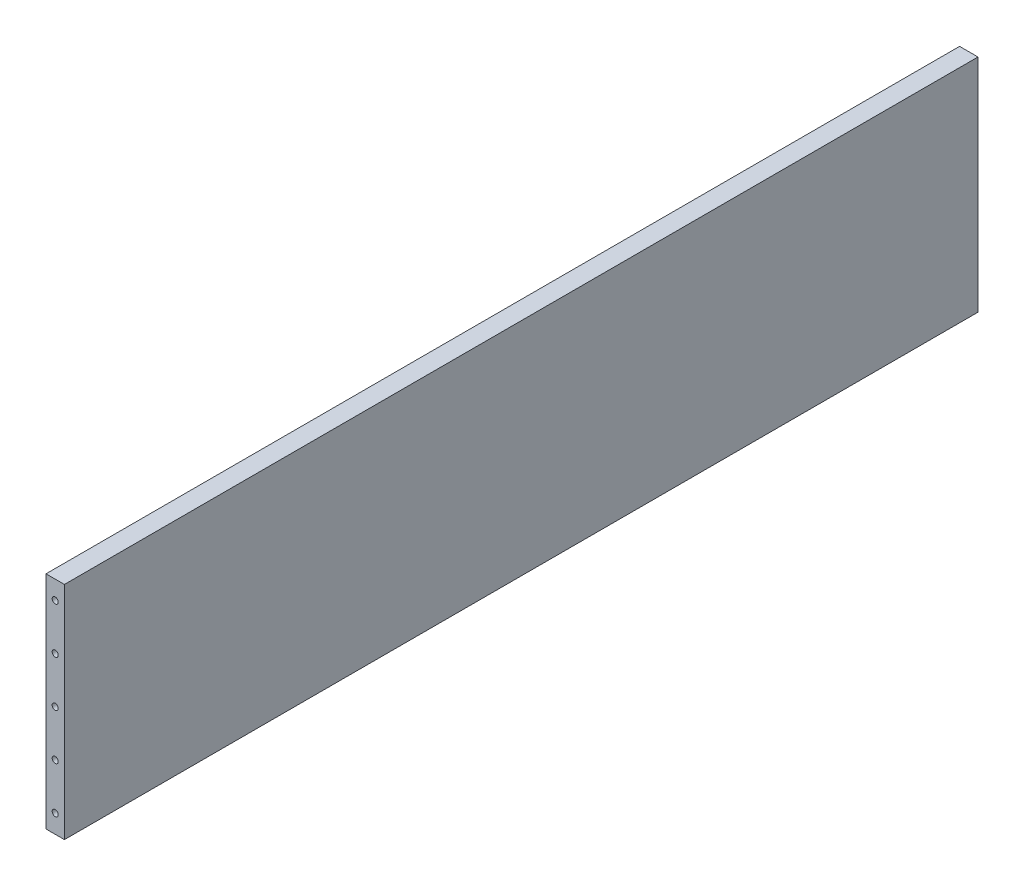
ISO-10303-21;
HEADER;
FILE_DESCRIPTION(('STEP AP214'),'2;1');
FILE_NAME('part.step','',(''),(''),'','','');
FILE_SCHEMA(('AUTOMOTIVE_DESIGN { 1 0 10303 214 1 1 1 1 }'));
ENDSEC;
DATA;
#1=APPLICATION_CONTEXT('core data for automotive mechanical design processes');
#2=APPLICATION_PROTOCOL_DEFINITION('international standard','automotive_design',2000,#1);
#3=PRODUCT_CONTEXT('',#1,'mechanical');
#4=PRODUCT('Part','Part','',(#3));
#5=PRODUCT_RELATED_PRODUCT_CATEGORY('part','',(#4));
#6=PRODUCT_DEFINITION_FORMATION('','',#4);
#7=PRODUCT_DEFINITION_CONTEXT('part definition',#1,'design');
#8=PRODUCT_DEFINITION('design','',#6,#7);
#9=PRODUCT_DEFINITION_SHAPE('','',#8);
#10=(LENGTH_UNIT() NAMED_UNIT(*) SI_UNIT(.MILLI.,.METRE.));
#11=(NAMED_UNIT(*) PLANE_ANGLE_UNIT() SI_UNIT($,.RADIAN.));
#12=(NAMED_UNIT(*) SI_UNIT($,.STERADIAN.) SOLID_ANGLE_UNIT());
#13=UNCERTAINTY_MEASURE_WITH_UNIT(LENGTH_MEASURE(1.E-05),#10,'distance_accuracy_value','');
#14=(GEOMETRIC_REPRESENTATION_CONTEXT(3) GLOBAL_UNCERTAINTY_ASSIGNED_CONTEXT((#13)) GLOBAL_UNIT_ASSIGNED_CONTEXT((#10,
#11,#12)) REPRESENTATION_CONTEXT('',''));
#15=CARTESIAN_POINT('',(0.,0.,0.));
#16=DIRECTION('',(0.,0.,1.));
#17=DIRECTION('',(1.,0.,0.));
#18=AXIS2_PLACEMENT_3D('',#15,#16,#17);
#19=CARTESIAN_POINT('',(0.,0.,496.));
#20=DIRECTION('',(-1.,0.,0.));
#21=DIRECTION('',(0.,0.,1.));
#22=AXIS2_PLACEMENT_3D('',#19,#20,#21);
#23=PLANE('',#22);
#24=DIRECTION('',(0.,1.,0.));
#25=VECTOR('',#24,1.);
#26=CARTESIAN_POINT('',(0.,0.,0.));
#27=LINE('',#26,#25);
#28=CARTESIAN_POINT('',(0.,-120.,0.));
#29=VERTEX_POINT('',#28);
#30=CARTESIAN_POINT('',(0.,0.,0.));
#31=VERTEX_POINT('',#30);
#32=EDGE_CURVE('E180',#29,#31,#27,.T.);
#33=ORIENTED_EDGE('',*,*,#32,.T.);
#34=DIRECTION('',(0.,0.,-1.));
#35=VECTOR('',#34,1.);
#36=CARTESIAN_POINT('',(0.,0.,496.));
#37=LINE('',#36,#35);
#38=CARTESIAN_POINT('',(0.,0.,496.));
#39=VERTEX_POINT('',#38);
#40=EDGE_CURVE('E11',#39,#31,#37,.T.);
#41=ORIENTED_EDGE('',*,*,#40,.F.);
#42=DIRECTION('',(0.,1.,0.));
#43=VECTOR('',#42,1.);
#44=CARTESIAN_POINT('',(0.,0.,496.));
#45=LINE('',#44,#43);
#46=CARTESIAN_POINT('',(0.,-120.,496.));
#47=VERTEX_POINT('',#46);
#48=EDGE_CURVE('E181',#47,#39,#45,.T.);
#49=ORIENTED_EDGE('',*,*,#48,.F.);
#50=DIRECTION('',(0.,0.,-1.));
#51=VECTOR('',#50,1.);
#52=CARTESIAN_POINT('',(0.,-120.,496.));
#53=LINE('',#52,#51);
#54=EDGE_CURVE('E187',#47,#29,#53,.T.);
#55=ORIENTED_EDGE('',*,*,#54,.T.);
#56=EDGE_LOOP('',(#33,#41,#49,#55));
#57=FACE_BOUND('',#56,.T.);
#58=ADVANCED_FACE('F33',(#57),#23,.F.);
#59=CARTESIAN_POINT('',(-9.99999999999999,0.,496.));
#60=DIRECTION('',(0.,-1.,0.));
#61=DIRECTION('',(0.,0.,-1.));
#62=AXIS2_PLACEMENT_3D('',#59,#60,#61);
#63=PLANE('',#62);
#64=DIRECTION('',(-1.,0.,0.));
#65=VECTOR('',#64,1.);
#66=CARTESIAN_POINT('',(-9.99999999999999,0.,0.));
#67=LINE('',#66,#65);
#68=CARTESIAN_POINT('',(-9.99999999999999,0.,0.));
#69=VERTEX_POINT('',#68);
#70=EDGE_CURVE('E190',#31,#69,#67,.T.);
#71=ORIENTED_EDGE('',*,*,#70,.T.);
#72=DIRECTION('',(0.,0.,-1.));
#73=VECTOR('',#72,1.);
#74=CARTESIAN_POINT('',(-9.99999999999999,0.,496.));
#75=LINE('',#74,#73);
#76=CARTESIAN_POINT('',(-9.99999999999999,0.,496.));
#77=VERTEX_POINT('',#76);
#78=EDGE_CURVE('E41',#77,#69,#75,.T.);
#79=ORIENTED_EDGE('',*,*,#78,.F.);
#80=DIRECTION('',(-1.,0.,0.));
#81=VECTOR('',#80,1.);
#82=CARTESIAN_POINT('',(-9.99999999999999,0.,496.));
#83=LINE('',#82,#81);
#84=EDGE_CURVE('E80',#39,#77,#83,.T.);
#85=ORIENTED_EDGE('',*,*,#84,.F.);
#86=ORIENTED_EDGE('',*,*,#40,.T.);
#87=EDGE_LOOP('',(#71,#79,#85,#86));
#88=FACE_BOUND('',#87,.T.);
#89=ADVANCED_FACE('F214',(#88),#63,.F.);
#90=CARTESIAN_POINT('',(-9.99999999999999,-120.,496.));
#91=DIRECTION('',(1.,0.,0.));
#92=DIRECTION('',(0.,0.,-1.));
#93=AXIS2_PLACEMENT_3D('',#90,#91,#92);
#94=PLANE('',#93);
#95=DIRECTION('',(0.,-1.,0.));
#96=VECTOR('',#95,1.);
#97=CARTESIAN_POINT('',(-9.99999999999999,-120.,0.));
#98=LINE('',#97,#96);
#99=CARTESIAN_POINT('',(-9.99999999999999,-120.,0.));
#100=VERTEX_POINT('',#99);
#101=EDGE_CURVE('E67',#69,#100,#98,.T.);
#102=ORIENTED_EDGE('',*,*,#101,.T.);
#103=DIRECTION('',(0.,0.,-1.));
#104=VECTOR('',#103,1.);
#105=CARTESIAN_POINT('',(-9.99999999999999,-120.,496.));
#106=LINE('',#105,#104);
#107=CARTESIAN_POINT('',(-9.99999999999999,-120.,496.));
#108=VERTEX_POINT('',#107);
#109=EDGE_CURVE('E195',#108,#100,#106,.T.);
#110=ORIENTED_EDGE('',*,*,#109,.F.);
#111=DIRECTION('',(0.,-1.,0.));
#112=VECTOR('',#111,1.);
#113=CARTESIAN_POINT('',(-9.99999999999999,-120.,496.));
#114=LINE('',#113,#112);
#115=EDGE_CURVE('E184',#77,#108,#114,.T.);
#116=ORIENTED_EDGE('',*,*,#115,.F.);
#117=ORIENTED_EDGE('',*,*,#78,.T.);
#118=EDGE_LOOP('',(#102,#110,#116,#117));
#119=FACE_BOUND('',#118,.T.);
#120=ADVANCED_FACE('F197',(#119),#94,.F.);
#121=CARTESIAN_POINT('',(0.,-120.,496.));
#122=DIRECTION('',(0.,1.,0.));
#123=DIRECTION('',(0.,0.,1.));
#124=AXIS2_PLACEMENT_3D('',#121,#122,#123);
#125=PLANE('',#124);
#126=DIRECTION('',(1.,0.,0.));
#127=VECTOR('',#126,1.);
#128=CARTESIAN_POINT('',(0.,-120.,0.));
#129=LINE('',#128,#127);
#130=EDGE_CURVE('E73',#100,#29,#129,.T.);
#131=ORIENTED_EDGE('',*,*,#130,.T.);
#132=ORIENTED_EDGE('',*,*,#54,.F.);
#133=DIRECTION('',(1.,0.,0.));
#134=VECTOR('',#133,1.);
#135=CARTESIAN_POINT('',(0.,-120.,496.));
#136=LINE('',#135,#134);
#137=EDGE_CURVE('E49',#108,#47,#136,.T.);
#138=ORIENTED_EDGE('',*,*,#137,.F.);
#139=ORIENTED_EDGE('',*,*,#109,.T.);
#140=EDGE_LOOP('',(#131,#132,#138,#139));
#141=FACE_BOUND('',#140,.T.);
#142=ADVANCED_FACE('F204',(#141),#125,.F.);
#143=CARTESIAN_POINT('',(0.,0.,496.));
#144=DIRECTION('',(0.,0.,-1.));
#145=DIRECTION('',(-1.,0.,0.));
#146=AXIS2_PLACEMENT_3D('',#143,#144,#145);
#147=PLANE('',#146);
#148=CARTESIAN_POINT('',(-5.00000000000017,-9.99999999999999,496.));
#149=DIRECTION('',(0.,0.,1.));
#150=DIRECTION('',(1.,0.,0.));
#151=AXIS2_PLACEMENT_3D('',#148,#149,#150);
#152=CIRCLE('',#151,1.64999999999999);
#153=CARTESIAN_POINT('',(-3.35000000000018,-9.99999999999999,496.));
#154=VERTEX_POINT('',#153);
#155=EDGE_CURVE('E150',#154,#154,#152,.T.);
#156=ORIENTED_EDGE('',*,*,#155,.F.);
#157=EDGE_LOOP('',(#156));
#158=FACE_BOUND('',#157,.T.);
#159=CARTESIAN_POINT('',(-5.00000000000008,-35.,496.));
#160=DIRECTION('',(0.,0.,1.));
#161=DIRECTION('',(1.,0.,0.));
#162=AXIS2_PLACEMENT_3D('',#159,#160,#161);
#163=CIRCLE('',#162,1.64999999999999);
#164=CARTESIAN_POINT('',(-3.35000000000009,-35.,496.));
#165=VERTEX_POINT('',#164);
#166=EDGE_CURVE('E156',#165,#165,#163,.T.);
#167=ORIENTED_EDGE('',*,*,#166,.F.);
#168=EDGE_LOOP('',(#167));
#169=FACE_BOUND('',#168,.T.);
#170=CARTESIAN_POINT('',(-4.99999999999999,-60.,496.));
#171=DIRECTION('',(0.,0.,1.));
#172=DIRECTION('',(1.,0.,0.));
#173=AXIS2_PLACEMENT_3D('',#170,#171,#172);
#174=CIRCLE('',#173,1.64999999999999);
#175=CARTESIAN_POINT('',(-3.35,-60.,496.));
#176=VERTEX_POINT('',#175);
#177=EDGE_CURVE('E162',#176,#176,#174,.T.);
#178=ORIENTED_EDGE('',*,*,#177,.F.);
#179=EDGE_LOOP('',(#178));
#180=FACE_BOUND('',#179,.T.);
#181=CARTESIAN_POINT('',(-5.00000000000008,-85.,496.));
#182=DIRECTION('',(0.,0.,1.));
#183=DIRECTION('',(1.,0.,0.));
#184=AXIS2_PLACEMENT_3D('',#181,#182,#183);
#185=CIRCLE('',#184,1.64999999999999);
#186=CARTESIAN_POINT('',(-3.35000000000009,-85.,496.));
#187=VERTEX_POINT('',#186);
#188=EDGE_CURVE('E168',#187,#187,#185,.T.);
#189=ORIENTED_EDGE('',*,*,#188,.F.);
#190=EDGE_LOOP('',(#189));
#191=FACE_BOUND('',#190,.T.);
#192=CARTESIAN_POINT('',(-5.00000000000017,-110.,496.));
#193=DIRECTION('',(0.,0.,1.));
#194=DIRECTION('',(1.,0.,0.));
#195=AXIS2_PLACEMENT_3D('',#192,#193,#194);
#196=CIRCLE('',#195,1.64999999999999);
#197=CARTESIAN_POINT('',(-3.35000000000018,-110.,496.));
#198=VERTEX_POINT('',#197);
#199=EDGE_CURVE('E174',#198,#198,#196,.T.);
#200=ORIENTED_EDGE('',*,*,#199,.F.);
#201=EDGE_LOOP('',(#200));
#202=FACE_BOUND('',#201,.T.);
#203=ORIENTED_EDGE('',*,*,#48,.T.);
#204=ORIENTED_EDGE('',*,*,#84,.T.);
#205=ORIENTED_EDGE('',*,*,#115,.T.);
#206=ORIENTED_EDGE('',*,*,#137,.T.);
#207=EDGE_LOOP('',(#203,#204,#205,#206));
#208=FACE_BOUND('',#207,.T.);
#209=ADVANCED_FACE('F206',(#158,#169,#180,#191,#202,#208),#147,.F.);
#210=CARTESIAN_POINT('',(0.,0.,0.));
#211=DIRECTION('',(0.,0.,-1.));
#212=DIRECTION('',(-1.,0.,0.));
#213=AXIS2_PLACEMENT_3D('',#210,#211,#212);
#214=PLANE('',#213);
#215=CARTESIAN_POINT('',(-4.99999999999982,-9.99999999999999,0.));
#216=DIRECTION('',(0.,0.,-1.));
#217=DIRECTION('',(-1.,0.,0.));
#218=AXIS2_PLACEMENT_3D('',#215,#216,#217);
#219=CIRCLE('',#218,1.64999999999999);
#220=CARTESIAN_POINT('',(-6.64999999999981,-9.99999999999999,0.));
#221=VERTEX_POINT('',#220);
#222=EDGE_CURVE('E122',#221,#221,#219,.T.);
#223=ORIENTED_EDGE('',*,*,#222,.F.);
#224=EDGE_LOOP('',(#223));
#225=FACE_BOUND('',#224,.T.);
#226=CARTESIAN_POINT('',(-4.99999999999991,-35.,0.));
#227=DIRECTION('',(0.,0.,-1.));
#228=DIRECTION('',(-1.,0.,0.));
#229=AXIS2_PLACEMENT_3D('',#226,#227,#228);
#230=CIRCLE('',#229,1.64999999999999);
#231=CARTESIAN_POINT('',(-6.6499999999999,-35.,0.));
#232=VERTEX_POINT('',#231);
#233=EDGE_CURVE('E121',#232,#232,#230,.T.);
#234=ORIENTED_EDGE('',*,*,#233,.F.);
#235=EDGE_LOOP('',(#234));
#236=FACE_BOUND('',#235,.T.);
#237=CARTESIAN_POINT('',(-4.99999999999999,-60.,0.));
#238=DIRECTION('',(0.,0.,-1.));
#239=DIRECTION('',(-1.,0.,0.));
#240=AXIS2_PLACEMENT_3D('',#237,#238,#239);
#241=CIRCLE('',#240,1.64999999999999);
#242=CARTESIAN_POINT('',(-6.64999999999998,-60.,0.));
#243=VERTEX_POINT('',#242);
#244=EDGE_CURVE('E132',#243,#243,#241,.T.);
#245=ORIENTED_EDGE('',*,*,#244,.F.);
#246=EDGE_LOOP('',(#245));
#247=FACE_BOUND('',#246,.T.);
#248=CARTESIAN_POINT('',(-4.99999999999991,-85.,0.));
#249=DIRECTION('',(0.,0.,-1.));
#250=DIRECTION('',(-1.,0.,0.));
#251=AXIS2_PLACEMENT_3D('',#248,#249,#250);
#252=CIRCLE('',#251,1.64999999999999);
#253=CARTESIAN_POINT('',(-6.6499999999999,-85.,0.));
#254=VERTEX_POINT('',#253);
#255=EDGE_CURVE('E138',#254,#254,#252,.T.);
#256=ORIENTED_EDGE('',*,*,#255,.F.);
#257=EDGE_LOOP('',(#256));
#258=FACE_BOUND('',#257,.T.);
#259=CARTESIAN_POINT('',(-4.99999999999982,-110.,0.));
#260=DIRECTION('',(0.,0.,-1.));
#261=DIRECTION('',(-1.,0.,0.));
#262=AXIS2_PLACEMENT_3D('',#259,#260,#261);
#263=CIRCLE('',#262,1.64999999999999);
#264=CARTESIAN_POINT('',(-6.64999999999981,-110.,0.));
#265=VERTEX_POINT('',#264);
#266=EDGE_CURVE('E144',#265,#265,#263,.T.);
#267=ORIENTED_EDGE('',*,*,#266,.F.);
#268=EDGE_LOOP('',(#267));
#269=FACE_BOUND('',#268,.T.);
#270=ORIENTED_EDGE('',*,*,#32,.F.);
#271=ORIENTED_EDGE('',*,*,#130,.F.);
#272=ORIENTED_EDGE('',*,*,#101,.F.);
#273=ORIENTED_EDGE('',*,*,#70,.F.);
#274=EDGE_LOOP('',(#270,#271,#272,#273));
#275=FACE_BOUND('',#274,.T.);
#276=ADVANCED_FACE('F200',(#225,#236,#247,#258,#269,#275),#214,.T.);
#277=CARTESIAN_POINT('',(-5.00000000000017,-110.,481.9));
#278=DIRECTION('',(0.,0.,1.));
#279=DIRECTION('',(1.,0.,0.));
#280=AXIS2_PLACEMENT_3D('',#277,#278,#279);
#281=CONICAL_SURFACE('',#280,1.65,1.02974425867666);
#282=CARTESIAN_POINT('',(-5.00000000000017,-110.,480.908579978605));
#283=VERTEX_POINT('',#282);
#284=VERTEX_LOOP('',#283);
#285=FACE_BOUND('',#284,.T.);
#286=CARTESIAN_POINT('',(-5.00000000000017,-110.,481.9));
#287=DIRECTION('',(0.,0.,1.));
#288=DIRECTION('',(1.,0.,0.));
#289=AXIS2_PLACEMENT_3D('',#286,#287,#288);
#290=CIRCLE('',#289,1.65);
#291=CARTESIAN_POINT('',(-3.35000000000017,-110.,481.9));
#292=VERTEX_POINT('',#291);
#293=EDGE_CURVE('E177',#292,#292,#290,.T.);
#294=ORIENTED_EDGE('',*,*,#293,.T.);
#295=EDGE_LOOP('',(#294));
#296=FACE_BOUND('',#295,.T.);
#297=ADVANCED_FACE('F244',(#285,#296),#281,.F.);
#298=CARTESIAN_POINT('',(-5.00000000000017,-110.,496.));
#299=DIRECTION('',(0.,0.,1.));
#300=DIRECTION('',(1.,0.,0.));
#301=AXIS2_PLACEMENT_3D('',#298,#299,#300);
#302=CYLINDRICAL_SURFACE('',#301,1.64999999999999);
#303=ORIENTED_EDGE('',*,*,#293,.F.);
#304=EDGE_LOOP('',(#303));
#305=FACE_BOUND('',#304,.T.);
#306=ORIENTED_EDGE('',*,*,#199,.T.);
#307=EDGE_LOOP('',(#306));
#308=FACE_BOUND('',#307,.T.);
#309=ADVANCED_FACE('F249',(#305,#308),#302,.F.);
#310=CARTESIAN_POINT('',(-5.00000000000008,-85.,481.9));
#311=DIRECTION('',(0.,0.,1.));
#312=DIRECTION('',(1.,0.,0.));
#313=AXIS2_PLACEMENT_3D('',#310,#311,#312);
#314=CONICAL_SURFACE('',#313,1.65,1.02974425867666);
#315=CARTESIAN_POINT('',(-5.00000000000008,-85.,480.908579978605));
#316=VERTEX_POINT('',#315);
#317=VERTEX_LOOP('',#316);
#318=FACE_BOUND('',#317,.T.);
#319=CARTESIAN_POINT('',(-5.00000000000008,-85.,481.9));
#320=DIRECTION('',(0.,0.,1.));
#321=DIRECTION('',(1.,0.,0.));
#322=AXIS2_PLACEMENT_3D('',#319,#320,#321);
#323=CIRCLE('',#322,1.65);
#324=CARTESIAN_POINT('',(-3.35000000000008,-85.,481.9));
#325=VERTEX_POINT('',#324);
#326=EDGE_CURVE('E171',#325,#325,#323,.T.);
#327=ORIENTED_EDGE('',*,*,#326,.T.);
#328=EDGE_LOOP('',(#327));
#329=FACE_BOUND('',#328,.T.);
#330=ADVANCED_FACE('F259',(#318,#329),#314,.F.);
#331=CARTESIAN_POINT('',(-5.00000000000008,-85.,496.));
#332=DIRECTION('',(0.,0.,1.));
#333=DIRECTION('',(1.,0.,0.));
#334=AXIS2_PLACEMENT_3D('',#331,#332,#333);
#335=CYLINDRICAL_SURFACE('',#334,1.64999999999999);
#336=ORIENTED_EDGE('',*,*,#326,.F.);
#337=EDGE_LOOP('',(#336));
#338=FACE_BOUND('',#337,.T.);
#339=ORIENTED_EDGE('',*,*,#188,.T.);
#340=EDGE_LOOP('',(#339));
#341=FACE_BOUND('',#340,.T.);
#342=ADVANCED_FACE('F269',(#338,#341),#335,.F.);
#343=CARTESIAN_POINT('',(-4.99999999999999,-60.,481.9));
#344=DIRECTION('',(0.,0.,1.));
#345=DIRECTION('',(1.,0.,0.));
#346=AXIS2_PLACEMENT_3D('',#343,#344,#345);
#347=CONICAL_SURFACE('',#346,1.65,1.02974425867666);
#348=CARTESIAN_POINT('',(-5.,-60.,480.908579978605));
#349=VERTEX_POINT('',#348);
#350=VERTEX_LOOP('',#349);
#351=FACE_BOUND('',#350,.T.);
#352=CARTESIAN_POINT('',(-4.99999999999999,-60.,481.9));
#353=DIRECTION('',(0.,0.,1.));
#354=DIRECTION('',(1.,0.,0.));
#355=AXIS2_PLACEMENT_3D('',#352,#353,#354);
#356=CIRCLE('',#355,1.65);
#357=CARTESIAN_POINT('',(-3.35,-60.,481.9));
#358=VERTEX_POINT('',#357);
#359=EDGE_CURVE('E165',#358,#358,#356,.T.);
#360=ORIENTED_EDGE('',*,*,#359,.T.);
#361=EDGE_LOOP('',(#360));
#362=FACE_BOUND('',#361,.T.);
#363=ADVANCED_FACE('F279',(#351,#362),#347,.F.);
#364=CARTESIAN_POINT('',(-4.99999999999999,-60.,496.));
#365=DIRECTION('',(0.,0.,1.));
#366=DIRECTION('',(1.,0.,0.));
#367=AXIS2_PLACEMENT_3D('',#364,#365,#366);
#368=CYLINDRICAL_SURFACE('',#367,1.64999999999999);
#369=ORIENTED_EDGE('',*,*,#359,.F.);
#370=EDGE_LOOP('',(#369));
#371=FACE_BOUND('',#370,.T.);
#372=ORIENTED_EDGE('',*,*,#177,.T.);
#373=EDGE_LOOP('',(#372));
#374=FACE_BOUND('',#373,.T.);
#375=ADVANCED_FACE('F289',(#371,#374),#368,.F.);
#376=CARTESIAN_POINT('',(-5.00000000000008,-35.,481.9));
#377=DIRECTION('',(0.,0.,1.));
#378=DIRECTION('',(1.,0.,0.));
#379=AXIS2_PLACEMENT_3D('',#376,#377,#378);
#380=CONICAL_SURFACE('',#379,1.65,1.02974425867666);
#381=CARTESIAN_POINT('',(-5.00000000000008,-35.,480.908579978605));
#382=VERTEX_POINT('',#381);
#383=VERTEX_LOOP('',#382);
#384=FACE_BOUND('',#383,.T.);
#385=CARTESIAN_POINT('',(-5.00000000000008,-35.,481.9));
#386=DIRECTION('',(0.,0.,1.));
#387=DIRECTION('',(1.,0.,0.));
#388=AXIS2_PLACEMENT_3D('',#385,#386,#387);
#389=CIRCLE('',#388,1.65);
#390=CARTESIAN_POINT('',(-3.35000000000008,-35.,481.9));
#391=VERTEX_POINT('',#390);
#392=EDGE_CURVE('E159',#391,#391,#389,.T.);
#393=ORIENTED_EDGE('',*,*,#392,.T.);
#394=EDGE_LOOP('',(#393));
#395=FACE_BOUND('',#394,.T.);
#396=ADVANCED_FACE('F299',(#384,#395),#380,.F.);
#397=CARTESIAN_POINT('',(-5.00000000000008,-35.,496.));
#398=DIRECTION('',(0.,0.,1.));
#399=DIRECTION('',(1.,0.,0.));
#400=AXIS2_PLACEMENT_3D('',#397,#398,#399);
#401=CYLINDRICAL_SURFACE('',#400,1.64999999999999);
#402=ORIENTED_EDGE('',*,*,#392,.F.);
#403=EDGE_LOOP('',(#402));
#404=FACE_BOUND('',#403,.T.);
#405=ORIENTED_EDGE('',*,*,#166,.T.);
#406=EDGE_LOOP('',(#405));
#407=FACE_BOUND('',#406,.T.);
#408=ADVANCED_FACE('F309',(#404,#407),#401,.F.);
#409=CARTESIAN_POINT('',(-5.00000000000017,-9.99999999999999,481.9));
#410=DIRECTION('',(0.,0.,1.));
#411=DIRECTION('',(1.,0.,0.));
#412=AXIS2_PLACEMENT_3D('',#409,#410,#411);
#413=CONICAL_SURFACE('',#412,1.65,1.02974425867666);
#414=CARTESIAN_POINT('',(-5.00000000000017,-9.99999999999999,480.908579978605));
#415=VERTEX_POINT('',#414);
#416=VERTEX_LOOP('',#415);
#417=FACE_BOUND('',#416,.T.);
#418=CARTESIAN_POINT('',(-5.00000000000017,-9.99999999999999,481.9));
#419=DIRECTION('',(0.,0.,1.));
#420=DIRECTION('',(1.,0.,0.));
#421=AXIS2_PLACEMENT_3D('',#418,#419,#420);
#422=CIRCLE('',#421,1.65);
#423=CARTESIAN_POINT('',(-3.35000000000017,-9.99999999999999,481.9));
#424=VERTEX_POINT('',#423);
#425=EDGE_CURVE('E153',#424,#424,#422,.T.);
#426=ORIENTED_EDGE('',*,*,#425,.T.);
#427=EDGE_LOOP('',(#426));
#428=FACE_BOUND('',#427,.T.);
#429=ADVANCED_FACE('F319',(#417,#428),#413,.F.);
#430=CARTESIAN_POINT('',(-5.00000000000017,-9.99999999999999,496.));
#431=DIRECTION('',(0.,0.,1.));
#432=DIRECTION('',(1.,0.,0.));
#433=AXIS2_PLACEMENT_3D('',#430,#431,#432);
#434=CYLINDRICAL_SURFACE('',#433,1.64999999999999);
#435=ORIENTED_EDGE('',*,*,#425,.F.);
#436=EDGE_LOOP('',(#435));
#437=FACE_BOUND('',#436,.T.);
#438=ORIENTED_EDGE('',*,*,#155,.T.);
#439=EDGE_LOOP('',(#438));
#440=FACE_BOUND('',#439,.T.);
#441=ADVANCED_FACE('F329',(#437,#440),#434,.F.);
#442=CARTESIAN_POINT('',(-4.99999999999982,-110.,14.1));
#443=DIRECTION('',(0.,0.,-1.));
#444=DIRECTION('',(-1.,0.,0.));
#445=AXIS2_PLACEMENT_3D('',#442,#443,#444);
#446=CONICAL_SURFACE('',#445,1.64999999999999,1.02974425867665);
#447=CARTESIAN_POINT('',(-4.99999999999982,-110.,15.0914200213955));
#448=VERTEX_POINT('',#447);
#449=VERTEX_LOOP('',#448);
#450=FACE_BOUND('',#449,.T.);
#451=CARTESIAN_POINT('',(-4.99999999999982,-110.,14.1));
#452=DIRECTION('',(0.,0.,-1.));
#453=DIRECTION('',(-1.,0.,0.));
#454=AXIS2_PLACEMENT_3D('',#451,#452,#453);
#455=CIRCLE('',#454,1.64999999999999);
#456=CARTESIAN_POINT('',(-6.64999999999981,-110.,14.1));
#457=VERTEX_POINT('',#456);
#458=EDGE_CURVE('E147',#457,#457,#455,.T.);
#459=ORIENTED_EDGE('',*,*,#458,.T.);
#460=EDGE_LOOP('',(#459));
#461=FACE_BOUND('',#460,.T.);
#462=ADVANCED_FACE('F339',(#450,#461),#446,.F.);
#463=CARTESIAN_POINT('',(-4.99999999999982,-110.,0.));
#464=DIRECTION('',(0.,0.,-1.));
#465=DIRECTION('',(-1.,0.,0.));
#466=AXIS2_PLACEMENT_3D('',#463,#464,#465);
#467=CYLINDRICAL_SURFACE('',#466,1.64999999999999);
#468=ORIENTED_EDGE('',*,*,#458,.F.);
#469=EDGE_LOOP('',(#468));
#470=FACE_BOUND('',#469,.T.);
#471=ORIENTED_EDGE('',*,*,#266,.T.);
#472=EDGE_LOOP('',(#471));
#473=FACE_BOUND('',#472,.T.);
#474=ADVANCED_FACE('F355',(#470,#473),#467,.F.);
#475=CARTESIAN_POINT('',(-4.99999999999991,-85.,14.1));
#476=DIRECTION('',(0.,0.,-1.));
#477=DIRECTION('',(-1.,0.,0.));
#478=AXIS2_PLACEMENT_3D('',#475,#476,#477);
#479=CONICAL_SURFACE('',#478,1.64999999999999,1.02974425867665);
#480=CARTESIAN_POINT('',(-4.99999999999991,-85.,15.0914200213955));
#481=VERTEX_POINT('',#480);
#482=VERTEX_LOOP('',#481);
#483=FACE_BOUND('',#482,.T.);
#484=CARTESIAN_POINT('',(-4.99999999999991,-85.,14.1));
#485=DIRECTION('',(0.,0.,-1.));
#486=DIRECTION('',(-1.,0.,0.));
#487=AXIS2_PLACEMENT_3D('',#484,#485,#486);
#488=CIRCLE('',#487,1.64999999999999);
#489=CARTESIAN_POINT('',(-6.64999999999989,-85.,14.1));
#490=VERTEX_POINT('',#489);
#491=EDGE_CURVE('E141',#490,#490,#488,.T.);
#492=ORIENTED_EDGE('',*,*,#491,.T.);
#493=EDGE_LOOP('',(#492));
#494=FACE_BOUND('',#493,.T.);
#495=ADVANCED_FACE('F365',(#483,#494),#479,.F.);
#496=CARTESIAN_POINT('',(-4.99999999999991,-85.,0.));
#497=DIRECTION('',(0.,0.,-1.));
#498=DIRECTION('',(-1.,0.,0.));
#499=AXIS2_PLACEMENT_3D('',#496,#497,#498);
#500=CYLINDRICAL_SURFACE('',#499,1.64999999999999);
#501=ORIENTED_EDGE('',*,*,#491,.F.);
#502=EDGE_LOOP('',(#501));
#503=FACE_BOUND('',#502,.T.);
#504=ORIENTED_EDGE('',*,*,#255,.T.);
#505=EDGE_LOOP('',(#504));
#506=FACE_BOUND('',#505,.T.);
#507=ADVANCED_FACE('F375',(#503,#506),#500,.F.);
#508=CARTESIAN_POINT('',(-4.99999999999999,-60.,14.1));
#509=DIRECTION('',(0.,0.,-1.));
#510=DIRECTION('',(-1.,0.,0.));
#511=AXIS2_PLACEMENT_3D('',#508,#509,#510);
#512=CONICAL_SURFACE('',#511,1.64999999999999,1.02974425867665);
#513=CARTESIAN_POINT('',(-5.,-60.,15.0914200213955));
#514=VERTEX_POINT('',#513);
#515=VERTEX_LOOP('',#514);
#516=FACE_BOUND('',#515,.T.);
#517=CARTESIAN_POINT('',(-4.99999999999999,-60.,14.1));
#518=DIRECTION('',(0.,0.,-1.));
#519=DIRECTION('',(-1.,0.,0.));
#520=AXIS2_PLACEMENT_3D('',#517,#518,#519);
#521=CIRCLE('',#520,1.64999999999999);
#522=CARTESIAN_POINT('',(-6.64999999999998,-60.,14.1));
#523=VERTEX_POINT('',#522);
#524=EDGE_CURVE('E135',#523,#523,#521,.T.);
#525=ORIENTED_EDGE('',*,*,#524,.T.);
#526=EDGE_LOOP('',(#525));
#527=FACE_BOUND('',#526,.T.);
#528=ADVANCED_FACE('F385',(#516,#527),#512,.F.);
#529=CARTESIAN_POINT('',(-4.99999999999999,-60.,0.));
#530=DIRECTION('',(0.,0.,-1.));
#531=DIRECTION('',(-1.,0.,0.));
#532=AXIS2_PLACEMENT_3D('',#529,#530,#531);
#533=CYLINDRICAL_SURFACE('',#532,1.64999999999999);
#534=ORIENTED_EDGE('',*,*,#524,.F.);
#535=EDGE_LOOP('',(#534));
#536=FACE_BOUND('',#535,.T.);
#537=ORIENTED_EDGE('',*,*,#244,.T.);
#538=EDGE_LOOP('',(#537));
#539=FACE_BOUND('',#538,.T.);
#540=ADVANCED_FACE('F395',(#536,#539),#533,.F.);
#541=CARTESIAN_POINT('',(-4.99999999999991,-35.,14.1));
#542=DIRECTION('',(0.,0.,-1.));
#543=DIRECTION('',(-1.,0.,0.));
#544=AXIS2_PLACEMENT_3D('',#541,#542,#543);
#545=CONICAL_SURFACE('',#544,1.64999999999999,1.02974425867665);
#546=CARTESIAN_POINT('',(-4.99999999999991,-35.,15.0914200213955));
#547=VERTEX_POINT('',#546);
#548=VERTEX_LOOP('',#547);
#549=FACE_BOUND('',#548,.T.);
#550=CARTESIAN_POINT('',(-4.99999999999991,-35.,14.1));
#551=DIRECTION('',(0.,0.,-1.));
#552=DIRECTION('',(-1.,0.,0.));
#553=AXIS2_PLACEMENT_3D('',#550,#551,#552);
#554=CIRCLE('',#553,1.64999999999999);
#555=CARTESIAN_POINT('',(-6.64999999999989,-35.,14.1));
#556=VERTEX_POINT('',#555);
#557=EDGE_CURVE('E125',#556,#556,#554,.T.);
#558=ORIENTED_EDGE('',*,*,#557,.T.);
#559=EDGE_LOOP('',(#558));
#560=FACE_BOUND('',#559,.T.);
#561=ADVANCED_FACE('F405',(#549,#560),#545,.F.);
#562=CARTESIAN_POINT('',(-4.99999999999991,-35.,0.));
#563=DIRECTION('',(0.,0.,-1.));
#564=DIRECTION('',(-1.,0.,0.));
#565=AXIS2_PLACEMENT_3D('',#562,#563,#564);
#566=CYLINDRICAL_SURFACE('',#565,1.64999999999999);
#567=ORIENTED_EDGE('',*,*,#557,.F.);
#568=EDGE_LOOP('',(#567));
#569=FACE_BOUND('',#568,.T.);
#570=ORIENTED_EDGE('',*,*,#233,.T.);
#571=EDGE_LOOP('',(#570));
#572=FACE_BOUND('',#571,.T.);
#573=ADVANCED_FACE('F115',(#569,#572),#566,.F.);
#574=CARTESIAN_POINT('',(-4.99999999999982,-9.99999999999999,14.1));
#575=DIRECTION('',(0.,0.,-1.));
#576=DIRECTION('',(-1.,0.,0.));
#577=AXIS2_PLACEMENT_3D('',#574,#575,#576);
#578=CONICAL_SURFACE('',#577,1.64999999999999,1.02974425867665);
#579=CARTESIAN_POINT('',(-4.99999999999982,-9.99999999999999,15.0914200213955));
#580=VERTEX_POINT('',#579);
#581=VERTEX_LOOP('',#580);
#582=FACE_BOUND('',#581,.T.);
#583=CARTESIAN_POINT('',(-4.99999999999982,-9.99999999999999,14.1));
#584=DIRECTION('',(0.,0.,-1.));
#585=DIRECTION('',(-1.,0.,0.));
#586=AXIS2_PLACEMENT_3D('',#583,#584,#585);
#587=CIRCLE('',#586,1.64999999999999);
#588=CARTESIAN_POINT('',(-6.64999999999981,-9.99999999999999,14.1));
#589=VERTEX_POINT('',#588);
#590=EDGE_CURVE('E119',#589,#589,#587,.T.);
#591=ORIENTED_EDGE('',*,*,#590,.T.);
#592=EDGE_LOOP('',(#591));
#593=FACE_BOUND('',#592,.T.);
#594=ADVANCED_FACE('F111',(#582,#593),#578,.F.);
#595=CARTESIAN_POINT('',(-4.99999999999982,-9.99999999999999,0.));
#596=DIRECTION('',(0.,0.,-1.));
#597=DIRECTION('',(-1.,0.,0.));
#598=AXIS2_PLACEMENT_3D('',#595,#596,#597);
#599=CYLINDRICAL_SURFACE('',#598,1.64999999999999);
#600=ORIENTED_EDGE('',*,*,#590,.F.);
#601=EDGE_LOOP('',(#600));
#602=FACE_BOUND('',#601,.T.);
#603=ORIENTED_EDGE('',*,*,#222,.T.);
#604=EDGE_LOOP('',(#603));
#605=FACE_BOUND('',#604,.T.);
#606=ADVANCED_FACE('F114',(#602,#605),#599,.F.);
#607=CLOSED_SHELL('',(#58,#89,#120,#142,#209,#276,#297,#309,#330,#342,#363,#375,#396,#408,#429,
#441,#462,#474,#495,#507,#528,#540,#561,#573,#594,#606));
#608=MANIFOLD_SOLID_BREP('B2',#607);
#609=ADVANCED_BREP_SHAPE_REPRESENTATION('',(#18,#608),#14);
#610=SHAPE_DEFINITION_REPRESENTATION(#9,#609);
ENDSEC;
END-ISO-10303-21;
